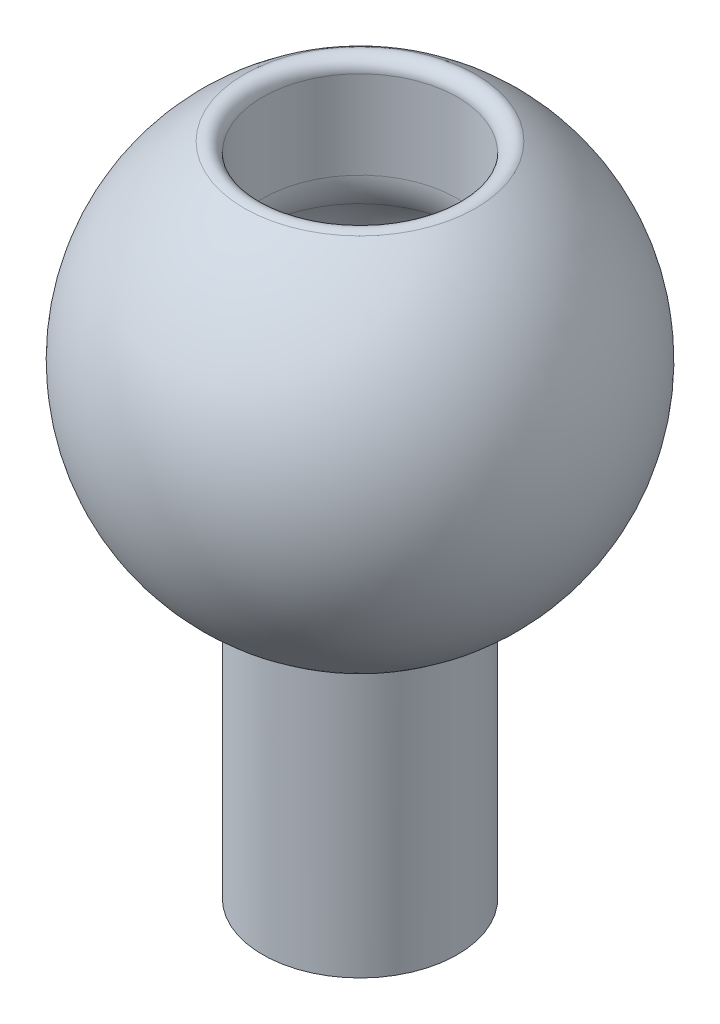
ISO-10303-21;
HEADER;
FILE_DESCRIPTION(('STEP AP214'),'2;1');
FILE_NAME('part.step','',(''),(''),'','','');
FILE_SCHEMA(('AUTOMOTIVE_DESIGN { 1 0 10303 214 1 1 1 1 }'));
ENDSEC;
DATA;
#1=APPLICATION_CONTEXT('core data for automotive mechanical design processes');
#2=APPLICATION_PROTOCOL_DEFINITION('international standard','automotive_design',2000,#1);
#3=PRODUCT_CONTEXT('',#1,'mechanical');
#4=PRODUCT('Part','Part','',(#3));
#5=PRODUCT_RELATED_PRODUCT_CATEGORY('part','',(#4));
#6=PRODUCT_DEFINITION_FORMATION('','',#4);
#7=PRODUCT_DEFINITION_CONTEXT('part definition',#1,'design');
#8=PRODUCT_DEFINITION('design','',#6,#7);
#9=PRODUCT_DEFINITION_SHAPE('','',#8);
#10=(LENGTH_UNIT() NAMED_UNIT(*) SI_UNIT(.MILLI.,.METRE.));
#11=(NAMED_UNIT(*) PLANE_ANGLE_UNIT() SI_UNIT($,.RADIAN.));
#12=(NAMED_UNIT(*) SI_UNIT($,.STERADIAN.) SOLID_ANGLE_UNIT());
#13=UNCERTAINTY_MEASURE_WITH_UNIT(LENGTH_MEASURE(1.E-05),#10,'distance_accuracy_value','');
#14=(GEOMETRIC_REPRESENTATION_CONTEXT(3) GLOBAL_UNCERTAINTY_ASSIGNED_CONTEXT((#13)) GLOBAL_UNIT_ASSIGNED_CONTEXT((#10,
#11,#12)) REPRESENTATION_CONTEXT('',''));
#15=CARTESIAN_POINT('',(0.,0.,0.));
#16=DIRECTION('',(0.,0.,1.));
#17=DIRECTION('',(1.,0.,0.));
#18=AXIS2_PLACEMENT_3D('',#15,#16,#17);
#19=CARTESIAN_POINT('',(0.,0.,0.));
#20=DIRECTION('',(-1.,0.,0.));
#21=DIRECTION('',(0.,0.,-1.));
#22=AXIS2_PLACEMENT_3D('',#19,#20,#21);
#23=SPHERICAL_SURFACE('',#22,18.2326960049071);
#24=CARTESIAN_POINT('',(0.,0.,0.));
#25=DIRECTION('',(0.,1.,0.));
#26=DIRECTION('',(0.,0.,1.));
#27=AXIS2_PLACEMENT_3D('',#24,#25,#26);
#28=SPHERICAL_SURFACE('',#27,18.2326960049071);
#29=CARTESIAN_POINT('',(0.,-16.3838702267613,0.));
#30=DIRECTION('',(0.,1.,0.));
#31=DIRECTION('',(0.,0.,1.));
#32=AXIS2_PLACEMENT_3D('',#29,#30,#31);
#33=CIRCLE('',#32,8.);
#34=CARTESIAN_POINT('',(0.,-16.3838702267613,8.));
#35=VERTEX_POINT('',#34);
#36=EDGE_CURVE('E11',#35,#35,#33,.F.);
#37=ORIENTED_EDGE('',*,*,#36,.F.);
#38=EDGE_LOOP('',(#37));
#39=FACE_BOUND('',#38,.T.);
#40=CARTESIAN_POINT('',(0.,15.5485597541592,0.));
#41=DIRECTION('',(0.,-1.,0.));
#42=DIRECTION('',(0.,0.,-1.));
#43=AXIS2_PLACEMENT_3D('',#40,#41,#42);
#44=CIRCLE('',#43,9.52226302822479);
#45=CARTESIAN_POINT('',(0.,15.5485597541592,-9.52226302822479));
#46=VERTEX_POINT('',#45);
#47=EDGE_CURVE('E49',#46,#46,#44,.T.);
#48=ORIENTED_EDGE('',*,*,#47,.T.);
#49=EDGE_LOOP('',(#48));
#50=FACE_BOUND('',#49,.T.);
#51=ADVANCED_FACE('F42',(#39,#50),#28,.T.);
#52=CARTESIAN_POINT('',(0.,2.23269600490708,0.));
#53=DIRECTION('',(0.,1.,0.));
#54=DIRECTION('',(0.,0.,1.));
#55=AXIS2_PLACEMENT_3D('',#52,#53,#54);
#56=CYLINDRICAL_SURFACE('',#55,8.);
#57=CARTESIAN_POINT('',(0.,14.6957752975997,0.));
#58=DIRECTION('',(0.,-1.,0.));
#59=DIRECTION('',(0.,0.,-1.));
#60=AXIS2_PLACEMENT_3D('',#57,#58,#59);
#61=CIRCLE('',#60,8.);
#62=CARTESIAN_POINT('',(0.,14.6957752975997,-8.));
#63=VERTEX_POINT('',#62);
#64=EDGE_CURVE('E53',#63,#63,#61,.F.);
#65=ORIENTED_EDGE('',*,*,#64,.T.);
#66=EDGE_LOOP('',(#65));
#67=FACE_BOUND('',#66,.T.);
#68=CARTESIAN_POINT('',(0.,7.48331477354788,0.));
#69=DIRECTION('',(0.,-1.,0.));
#70=DIRECTION('',(0.,0.,-1.));
#71=AXIS2_PLACEMENT_3D('',#68,#69,#70);
#72=CIRCLE('',#71,8.);
#73=CARTESIAN_POINT('',(0.,7.48331477354788,-8.));
#74=VERTEX_POINT('',#73);
#75=EDGE_CURVE('E57',#74,#74,#72,.T.);
#76=ORIENTED_EDGE('',*,*,#75,.T.);
#77=EDGE_LOOP('',(#76));
#78=FACE_BOUND('',#77,.T.);
#79=ADVANCED_FACE('F83',(#67,#78),#56,.F.);
#80=CARTESIAN_POINT('',(0.,0.,0.));
#81=DIRECTION('',(-1.,0.,0.));
#82=DIRECTION('',(0.,0.,-1.));
#83=AXIS2_PLACEMENT_3D('',#80,#81,#82);
#84=SPHERICAL_SURFACE('',#83,10.);
#85=CARTESIAN_POINT('',(0.,0.,0.));
#86=DIRECTION('',(0.,-1.,0.));
#87=DIRECTION('',(0.,0.,-1.));
#88=AXIS2_PLACEMENT_3D('',#85,#86,#87);
#89=SPHERICAL_SURFACE('',#88,10.);
#90=CARTESIAN_POINT('',(0.,4.98887651569859,0.));
#91=DIRECTION('',(0.,-1.,0.));
#92=DIRECTION('',(0.,0.,-1.));
#93=AXIS2_PLACEMENT_3D('',#90,#91,#92);
#94=CIRCLE('',#93,8.66666666666667);
#95=CARTESIAN_POINT('',(0.,4.98887651569859,-8.66666666666667));
#96=VERTEX_POINT('',#95);
#97=EDGE_CURVE('E62',#96,#96,#94,.F.);
#98=ORIENTED_EDGE('',*,*,#97,.T.);
#99=EDGE_LOOP('',(#98));
#100=FACE_BOUND('',#99,.T.);
#101=ADVANCED_FACE('F89',(#100),#89,.F.);
#102=CARTESIAN_POINT('',(0.,7.48331477354788,0.));
#103=DIRECTION('',(0.,-1.,0.));
#104=DIRECTION('',(0.,0.,-1.));
#105=AXIS2_PLACEMENT_3D('',#102,#103,#104);
#106=TOROIDAL_SURFACE('',#105,13.,5.);
#107=ORIENTED_EDGE('',*,*,#75,.F.);
#108=EDGE_LOOP('',(#107));
#109=FACE_BOUND('',#108,.T.);
#110=ORIENTED_EDGE('',*,*,#97,.F.);
#111=EDGE_LOOP('',(#110));
#112=FACE_BOUND('',#111,.T.);
#113=ADVANCED_FACE('F79',(#109,#112),#106,.T.);
#114=CARTESIAN_POINT('',(0.,14.6957752975997,0.));
#115=DIRECTION('',(0.,-1.,0.));
#116=DIRECTION('',(0.,0.,-1.));
#117=AXIS2_PLACEMENT_3D('',#114,#115,#116);
#118=TOROIDAL_SURFACE('',#117,9.,1.);
#119=ORIENTED_EDGE('',*,*,#47,.F.);
#120=EDGE_LOOP('',(#119));
#121=FACE_BOUND('',#120,.T.);
#122=ORIENTED_EDGE('',*,*,#64,.F.);
#123=EDGE_LOOP('',(#122));
#124=FACE_BOUND('',#123,.T.);
#125=ADVANCED_FACE('F44',(#121,#124),#118,.T.);
#126=CARTESIAN_POINT('',(0.,-15.2326960049071,0.));
#127=DIRECTION('',(0.,-1.,0.));
#128=DIRECTION('',(0.,0.,-1.));
#129=AXIS2_PLACEMENT_3D('',#126,#127,#128);
#130=CYLINDRICAL_SURFACE('',#129,8.);
#131=ORIENTED_EDGE('',*,*,#36,.T.);
#132=EDGE_LOOP('',(#131));
#133=FACE_BOUND('',#132,.T.);
#134=CARTESIAN_POINT('',(0.,-38.3176960049071,0.));
#135=DIRECTION('',(0.,-1.,0.));
#136=DIRECTION('',(0.,0.,-1.));
#137=AXIS2_PLACEMENT_3D('',#134,#135,#136);
#138=CIRCLE('',#137,8.);
#139=CARTESIAN_POINT('',(0.,-38.3176960049071,-8.));
#140=VERTEX_POINT('',#139);
#141=EDGE_CURVE('E65',#140,#140,#138,.T.);
#142=ORIENTED_EDGE('',*,*,#141,.F.);
#143=EDGE_LOOP('',(#142));
#144=FACE_BOUND('',#143,.T.);
#145=ADVANCED_FACE('F71',(#133,#144),#130,.T.);
#146=CARTESIAN_POINT('',(0.,-38.3176960049071,0.));
#147=DIRECTION('',(0.,-1.,0.));
#148=DIRECTION('',(0.,0.,-1.));
#149=AXIS2_PLACEMENT_3D('',#146,#147,#148);
#150=PLANE('',#149);
#151=ORIENTED_EDGE('',*,*,#141,.T.);
#152=EDGE_LOOP('',(#151));
#153=FACE_BOUND('',#152,.T.);
#154=ADVANCED_FACE('F69',(#153),#150,.T.);
#155=CLOSED_SHELL('',(#51,#79,#101,#113,#125,#145,#154));
#156=MANIFOLD_SOLID_BREP('B2',#155);
#157=ADVANCED_BREP_SHAPE_REPRESENTATION('',(#18,#156),#14);
#158=SHAPE_DEFINITION_REPRESENTATION(#9,#157);
ENDSEC;
END-ISO-10303-21;
